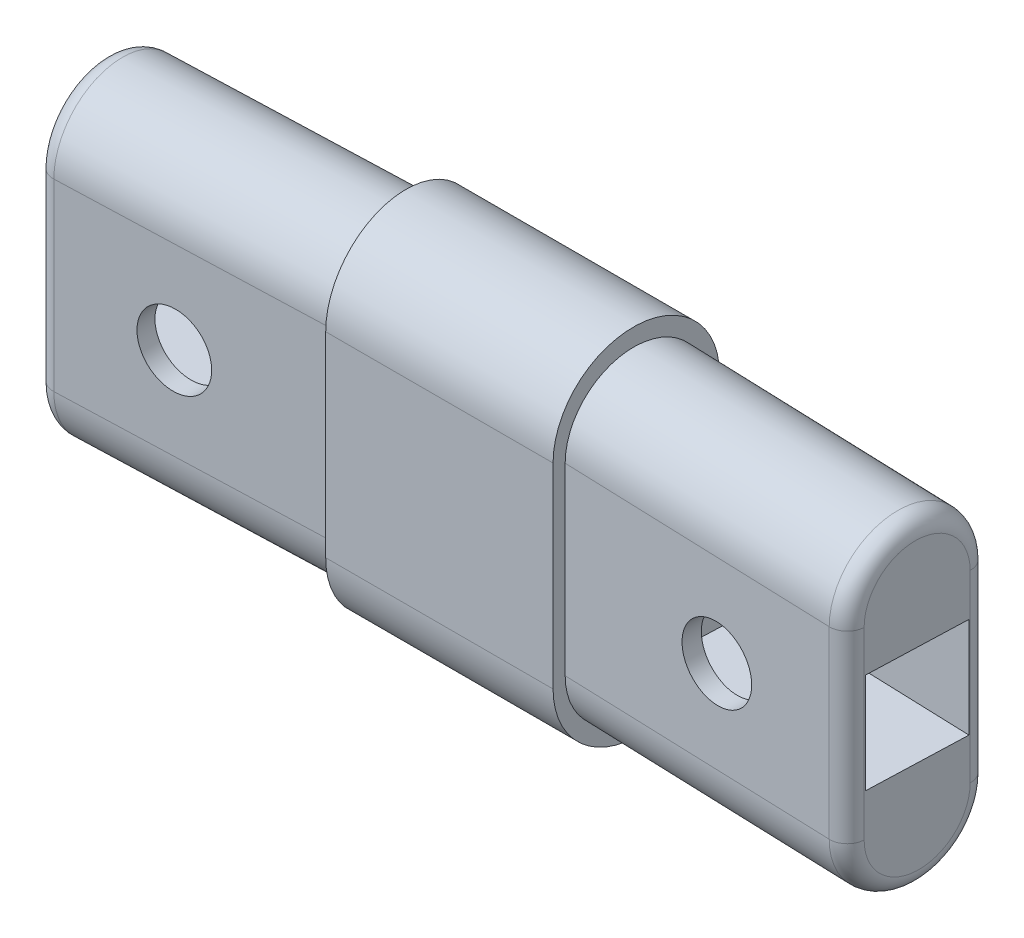
ISO-10303-21;
HEADER;
FILE_DESCRIPTION(('STEP AP214'),'2;1');
FILE_NAME('part.step','',(''),(''),'','','');
FILE_SCHEMA(('AUTOMOTIVE_DESIGN { 1 0 10303 214 1 1 1 1 }'));
ENDSEC;
DATA;
#1=APPLICATION_CONTEXT('core data for automotive mechanical design processes');
#2=APPLICATION_PROTOCOL_DEFINITION('international standard','automotive_design',2000,#1);
#3=PRODUCT_CONTEXT('',#1,'mechanical');
#4=PRODUCT('Part','Part','',(#3));
#5=PRODUCT_RELATED_PRODUCT_CATEGORY('part','',(#4));
#6=PRODUCT_DEFINITION_FORMATION('','',#4);
#7=PRODUCT_DEFINITION_CONTEXT('part definition',#1,'design');
#8=PRODUCT_DEFINITION('design','',#6,#7);
#9=PRODUCT_DEFINITION_SHAPE('','',#8);
#10=(LENGTH_UNIT() NAMED_UNIT(*) SI_UNIT(.MILLI.,.METRE.));
#11=(NAMED_UNIT(*) PLANE_ANGLE_UNIT() SI_UNIT($,.RADIAN.));
#12=(NAMED_UNIT(*) SI_UNIT($,.STERADIAN.) SOLID_ANGLE_UNIT());
#13=UNCERTAINTY_MEASURE_WITH_UNIT(LENGTH_MEASURE(1.E-05),#10,'distance_accuracy_value','');
#14=(GEOMETRIC_REPRESENTATION_CONTEXT(3) GLOBAL_UNCERTAINTY_ASSIGNED_CONTEXT((#13)) GLOBAL_UNIT_ASSIGNED_CONTEXT((#10,
#11,#12)) REPRESENTATION_CONTEXT('',''));
#15=CARTESIAN_POINT('',(0.,0.,0.));
#16=DIRECTION('',(0.,0.,1.));
#17=DIRECTION('',(1.,0.,0.));
#18=AXIS2_PLACEMENT_3D('',#15,#16,#17);
#19=CARTESIAN_POINT('',(-34.9847706754774,-7.9,0.872487417562356));
#20=DIRECTION('',(-0.999390827019096,0.,0.0348994967024943));
#21=DIRECTION('',(-0.0348994967024943,0.,-0.999390827019096));
#22=AXIS2_PLACEMENT_3D('',#19,#20,#21);
#23=PLANE('',#22);
#24=CARTESIAN_POINT('',(-34.9847706754774,7.9,0.872487417562356));
#25=DIRECTION('',(-0.999390827019096,0.,0.0348994967024943));
#26=DIRECTION('',(0.0348994967024943,0.,0.999390827019096));
#27=AXIS2_PLACEMENT_3D('',#24,#25,#26);
#28=CIRCLE('',#27,4.4);
#29=CARTESIAN_POINT('',(-34.8312128899864,7.9,5.26980705644638));
#30=VERTEX_POINT('',#29);
#31=CARTESIAN_POINT('',(-35.1383284609684,7.9,-3.52483222132167));
#32=VERTEX_POINT('',#31);
#33=EDGE_CURVE('E384',#30,#32,#28,.T.);
#34=ORIENTED_EDGE('',*,*,#33,.T.);
#35=DIRECTION('',(0.,1.,0.));
#36=VECTOR('',#35,1.);
#37=CARTESIAN_POINT('',(-35.1383284609684,-7.9,-3.52483222132167));
#38=LINE('',#37,#36);
#39=CARTESIAN_POINT('',(-35.1383284609684,-7.9,-3.52483222132167));
#40=VERTEX_POINT('',#39);
#41=EDGE_CURVE('E386',#32,#40,#38,.F.);
#42=ORIENTED_EDGE('',*,*,#41,.T.);
#43=CARTESIAN_POINT('',(-34.9847706754774,-7.9,0.872487417562356));
#44=DIRECTION('',(-0.999390827019096,0.,0.0348994967024943));
#45=DIRECTION('',(0.0348994967024943,0.,0.999390827019096));
#46=AXIS2_PLACEMENT_3D('',#43,#44,#45);
#47=CIRCLE('',#46,4.4);
#48=CARTESIAN_POINT('',(-34.8312128899864,-7.9,5.26980705644638));
#49=VERTEX_POINT('',#48);
#50=EDGE_CURVE('E380',#40,#49,#47,.T.);
#51=ORIENTED_EDGE('',*,*,#50,.T.);
#52=DIRECTION('',(0.,-1.,0.));
#53=VECTOR('',#52,1.);
#54=CARTESIAN_POINT('',(-34.8312128899864,-7.9,5.26980705644638));
#55=LINE('',#54,#53);
#56=EDGE_CURVE('E382',#49,#30,#55,.F.);
#57=ORIENTED_EDGE('',*,*,#56,.T.);
#58=EDGE_LOOP('',(#34,#42,#51,#57));
#59=FACE_BOUND('',#58,.T.);
#60=DIRECTION('',(0.0348994967024943,0.,0.999390827019096));
#61=VECTOR('',#60,1.);
#62=CARTESIAN_POINT('',(-35.1348385112981,4.3,-3.42489313861976));
#63=LINE('',#62,#61);
#64=CARTESIAN_POINT('',(-35.1348385112981,4.3,-3.42489313861976));
#65=VERTEX_POINT('',#64);
#66=CARTESIAN_POINT('',(-34.8347028396567,4.3,5.16986797374447));
#67=VERTEX_POINT('',#66);
#68=EDGE_CURVE('E228',#65,#67,#63,.T.);
#69=ORIENTED_EDGE('',*,*,#68,.T.);
#70=DIRECTION('',(0.,-1.,0.));
#71=VECTOR('',#70,1.);
#72=CARTESIAN_POINT('',(-34.8347028396567,4.3,5.16986797374447));
#73=LINE('',#72,#71);
#74=CARTESIAN_POINT('',(-34.8347028396567,-4.3,5.16986797374447));
#75=VERTEX_POINT('',#74);
#76=EDGE_CURVE('E51',#67,#75,#73,.T.);
#77=ORIENTED_EDGE('',*,*,#76,.T.);
#78=DIRECTION('',(-0.0348994967024943,0.,-0.999390827019096));
#79=VECTOR('',#78,1.);
#80=CARTESIAN_POINT('',(-35.1348385112981,-4.3,-3.42489313861976));
#81=LINE('',#80,#79);
#82=CARTESIAN_POINT('',(-35.1348385112981,-4.3,-3.42489313861976));
#83=VERTEX_POINT('',#82);
#84=EDGE_CURVE('E216',#75,#83,#81,.T.);
#85=ORIENTED_EDGE('',*,*,#84,.T.);
#86=DIRECTION('',(0.,1.,0.));
#87=VECTOR('',#86,1.);
#88=CARTESIAN_POINT('',(-35.1348385112981,4.3,-3.42489313861976));
#89=LINE('',#88,#87);
#90=EDGE_CURVE('E219',#83,#65,#89,.T.);
#91=ORIENTED_EDGE('',*,*,#90,.T.);
#92=EDGE_LOOP('',(#69,#77,#85,#91));
#93=FACE_BOUND('',#92,.T.);
#94=ADVANCED_FACE('F34',(#59,#93),#23,.T.);
#95=CARTESIAN_POINT('',(10.3492076949174,-15.3,-10.));
#96=DIRECTION('',(-0.999390827019096,0.,-0.0348994967024942));
#97=DIRECTION('',(-0.0348994967024942,0.,0.999390827019096));
#98=AXIS2_PLACEMENT_3D('',#95,#96,#97);
#99=PLANE('',#98);
#100=CARTESIAN_POINT('',(10.,8.4,0.));
#101=DIRECTION('',(-0.999390827019096,0.,-0.0348994967024942));
#102=DIRECTION('',(0.0348994967024942,0.,-0.999390827019096));
#103=AXIS2_PLACEMENT_3D('',#100,#101,#102);
#104=ELLIPSE('',#103,6.90420585566187,6.90000000000001);
#105=CARTESIAN_POINT('',(9.75904669050698,8.4,6.90000000000001));
#106=VERTEX_POINT('',#105);
#107=CARTESIAN_POINT('',(10.240953309493,8.4,-6.9));
#108=VERTEX_POINT('',#107);
#109=EDGE_CURVE('E318',#106,#108,#104,.T.);
#110=ORIENTED_EDGE('',*,*,#109,.F.);
#111=DIRECTION('',(0.,1.,0.));
#112=VECTOR('',#111,1.);
#113=CARTESIAN_POINT('',(9.75904669050698,8.4,6.90000000000001));
#114=LINE('',#113,#112);
#115=CARTESIAN_POINT('',(9.75904669050698,-8.4,6.90000000000001));
#116=VERTEX_POINT('',#115);
#117=EDGE_CURVE('E345',#116,#106,#114,.T.);
#118=ORIENTED_EDGE('',*,*,#117,.F.);
#119=CARTESIAN_POINT('',(10.,-8.4,0.));
#120=DIRECTION('',(-0.999390827019096,0.,-0.0348994967024942));
#121=DIRECTION('',(0.0348994967024942,0.,-0.999390827019096));
#122=AXIS2_PLACEMENT_3D('',#119,#120,#121);
#123=ELLIPSE('',#122,6.90420585566187,6.90000000000001);
#124=CARTESIAN_POINT('',(10.240953309493,-8.4,-6.90000000000001));
#125=VERTEX_POINT('',#124);
#126=EDGE_CURVE('E319',#125,#116,#123,.T.);
#127=ORIENTED_EDGE('',*,*,#126,.F.);
#128=DIRECTION('',(0.,-1.,0.));
#129=VECTOR('',#128,1.);
#130=CARTESIAN_POINT('',(10.240953309493,8.4,-6.9));
#131=LINE('',#130,#129);
#132=EDGE_CURVE('E321',#108,#125,#131,.T.);
#133=ORIENTED_EDGE('',*,*,#132,.F.);
#134=EDGE_LOOP('',(#110,#118,#127,#133));
#135=FACE_BOUND('',#134,.T.);
#136=CARTESIAN_POINT('',(10.,-7.9,0.));
#137=DIRECTION('',(0.999390827019096,0.,0.0348994967024943));
#138=DIRECTION('',(0.0348994967024943,0.,-0.999390827019096));
#139=AXIS2_PLACEMENT_3D('',#136,#137,#138);
#140=CIRCLE('',#139,5.9);
#141=CARTESIAN_POINT('',(9.79409296945528,-7.9,5.89640587941267));
#142=VERTEX_POINT('',#141);
#143=CARTESIAN_POINT('',(10.2059070305447,-7.9,-5.89640587941267));
#144=VERTEX_POINT('',#143);
#145=EDGE_CURVE('E297',#142,#144,#140,.T.);
#146=ORIENTED_EDGE('',*,*,#145,.F.);
#147=DIRECTION('',(0.,-1.,0.));
#148=VECTOR('',#147,1.);
#149=CARTESIAN_POINT('',(9.79409296945528,-7.9,5.89640587941267));
#150=LINE('',#149,#148);
#151=CARTESIAN_POINT('',(9.79409296945528,7.9,5.89640587941267));
#152=VERTEX_POINT('',#151);
#153=EDGE_CURVE('E307',#152,#142,#150,.T.);
#154=ORIENTED_EDGE('',*,*,#153,.F.);
#155=CARTESIAN_POINT('',(10.,7.9,0.));
#156=DIRECTION('',(0.999390827019096,0.,0.0348994967024943));
#157=DIRECTION('',(0.0348994967024943,0.,-0.999390827019096));
#158=AXIS2_PLACEMENT_3D('',#155,#156,#157);
#159=CIRCLE('',#158,5.9);
#160=CARTESIAN_POINT('',(10.2059070305447,7.9,-5.89640587941267));
#161=VERTEX_POINT('',#160);
#162=EDGE_CURVE('E304',#161,#152,#159,.T.);
#163=ORIENTED_EDGE('',*,*,#162,.F.);
#164=DIRECTION('',(0.,1.,0.));
#165=VECTOR('',#164,1.);
#166=CARTESIAN_POINT('',(10.2059070305447,-7.9,-5.89640587941267));
#167=LINE('',#166,#165);
#168=EDGE_CURVE('E300',#144,#161,#167,.T.);
#169=ORIENTED_EDGE('',*,*,#168,.F.);
#170=EDGE_LOOP('',(#146,#154,#163,#169));
#171=FACE_BOUND('',#170,.T.);
#172=ADVANCED_FACE('F445',(#135,#171),#99,.F.);
#173=CARTESIAN_POINT('',(-12.,8.4,0.));
#174=DIRECTION('',(1.,0.,0.));
#175=DIRECTION('',(0.,0.,-1.));
#176=AXIS2_PLACEMENT_3D('',#173,#174,#175);
#177=CYLINDRICAL_SURFACE('',#176,6.90000000000001);
#178=CARTESIAN_POINT('',(-10.,8.4,0.));
#179=DIRECTION('',(0.999390827019096,0.,-0.0348994967024942));
#180=DIRECTION('',(0.0348994967024942,0.,0.999390827019096));
#181=AXIS2_PLACEMENT_3D('',#178,#179,#180);
#182=ELLIPSE('',#181,6.90420585566187,6.90000000000001);
#183=CARTESIAN_POINT('',(-10.240953309493,8.4,-6.9));
#184=VERTEX_POINT('',#183);
#185=CARTESIAN_POINT('',(-9.75904669050698,8.4,6.90000000000001));
#186=VERTEX_POINT('',#185);
#187=EDGE_CURVE('E331',#184,#186,#182,.T.);
#188=ORIENTED_EDGE('',*,*,#187,.T.);
#189=DIRECTION('',(1.,0.,0.));
#190=VECTOR('',#189,1.);
#191=CARTESIAN_POINT('',(-12.,8.4,6.90000000000001));
#192=LINE('',#191,#190);
#193=EDGE_CURVE('E333',#186,#106,#192,.T.);
#194=ORIENTED_EDGE('',*,*,#193,.T.);
#195=ORIENTED_EDGE('',*,*,#109,.T.);
#196=DIRECTION('',(1.,0.,0.));
#197=VECTOR('',#196,1.);
#198=CARTESIAN_POINT('',(-12.,8.4,-6.9));
#199=LINE('',#198,#197);
#200=EDGE_CURVE('E342',#184,#108,#199,.T.);
#201=ORIENTED_EDGE('',*,*,#200,.F.);
#202=EDGE_LOOP('',(#188,#194,#195,#201));
#203=FACE_BOUND('',#202,.T.);
#204=ADVANCED_FACE('F450',(#203),#177,.T.);
#205=CARTESIAN_POINT('',(-12.,8.4,-6.9));
#206=DIRECTION('',(0.,0.,1.));
#207=DIRECTION('',(1.,0.,0.));
#208=AXIS2_PLACEMENT_3D('',#205,#206,#207);
#209=PLANE('',#208);
#210=DIRECTION('',(1.,0.,0.));
#211=VECTOR('',#210,1.);
#212=CARTESIAN_POINT('',(-12.,-8.4,-6.90000000000001));
#213=LINE('',#212,#211);
#214=CARTESIAN_POINT('',(-10.240953309493,-8.4,-6.90000000000001));
#215=VERTEX_POINT('',#214);
#216=EDGE_CURVE('E339',#215,#125,#213,.T.);
#217=ORIENTED_EDGE('',*,*,#216,.F.);
#218=DIRECTION('',(0.,1.,0.));
#219=VECTOR('',#218,1.);
#220=CARTESIAN_POINT('',(-10.240953309493,8.4,-6.9));
#221=LINE('',#220,#219);
#222=EDGE_CURVE('E328',#215,#184,#221,.T.);
#223=ORIENTED_EDGE('',*,*,#222,.T.);
#224=ORIENTED_EDGE('',*,*,#200,.T.);
#225=ORIENTED_EDGE('',*,*,#132,.T.);
#226=EDGE_LOOP('',(#217,#223,#224,#225));
#227=FACE_BOUND('',#226,.T.);
#228=ADVANCED_FACE('F490',(#227),#209,.F.);
#229=CARTESIAN_POINT('',(-12.,-8.4,0.));
#230=DIRECTION('',(1.,0.,0.));
#231=DIRECTION('',(0.,0.,-1.));
#232=AXIS2_PLACEMENT_3D('',#229,#230,#231);
#233=CYLINDRICAL_SURFACE('',#232,6.90000000000001);
#234=CARTESIAN_POINT('',(-10.,-8.4,0.));
#235=DIRECTION('',(0.999390827019096,0.,-0.0348994967024942));
#236=DIRECTION('',(0.0348994967024942,0.,0.999390827019096));
#237=AXIS2_PLACEMENT_3D('',#234,#235,#236);
#238=ELLIPSE('',#237,6.90420585566187,6.90000000000001);
#239=CARTESIAN_POINT('',(-9.75904669050698,-8.4,6.90000000000001));
#240=VERTEX_POINT('',#239);
#241=EDGE_CURVE('E326',#240,#215,#238,.T.);
#242=ORIENTED_EDGE('',*,*,#241,.T.);
#243=ORIENTED_EDGE('',*,*,#216,.T.);
#244=ORIENTED_EDGE('',*,*,#126,.T.);
#245=DIRECTION('',(1.,0.,0.));
#246=VECTOR('',#245,1.);
#247=CARTESIAN_POINT('',(-12.,-8.4,6.90000000000001));
#248=LINE('',#247,#246);
#249=EDGE_CURVE('E336',#240,#116,#248,.T.);
#250=ORIENTED_EDGE('',*,*,#249,.F.);
#251=EDGE_LOOP('',(#242,#243,#244,#250));
#252=FACE_BOUND('',#251,.T.);
#253=ADVANCED_FACE('F494',(#252),#233,.T.);
#254=CARTESIAN_POINT('',(-12.,8.4,6.90000000000001));
#255=DIRECTION('',(0.,0.,-1.));
#256=DIRECTION('',(-1.,0.,0.));
#257=AXIS2_PLACEMENT_3D('',#254,#255,#256);
#258=PLANE('',#257);
#259=ORIENTED_EDGE('',*,*,#193,.F.);
#260=DIRECTION('',(0.,-1.,0.));
#261=VECTOR('',#260,1.);
#262=CARTESIAN_POINT('',(-9.75904669050698,8.4,6.90000000000001));
#263=LINE('',#262,#261);
#264=EDGE_CURVE('E348',#186,#240,#263,.T.);
#265=ORIENTED_EDGE('',*,*,#264,.T.);
#266=ORIENTED_EDGE('',*,*,#249,.T.);
#267=ORIENTED_EDGE('',*,*,#117,.T.);
#268=EDGE_LOOP('',(#259,#265,#266,#267));
#269=FACE_BOUND('',#268,.T.);
#270=ADVANCED_FACE('F498',(#269),#258,.F.);
#271=CARTESIAN_POINT('',(-10.3492076949174,-15.3,-10.));
#272=DIRECTION('',(0.999390827019096,0.,-0.0348994967024942));
#273=DIRECTION('',(-0.0348994967024942,0.,-0.999390827019096));
#274=AXIS2_PLACEMENT_3D('',#271,#272,#273);
#275=PLANE('',#274);
#276=DIRECTION('',(0.,-1.,0.));
#277=VECTOR('',#276,1.);
#278=CARTESIAN_POINT('',(-9.79409296945528,-7.9,5.89640587941267));
#279=LINE('',#278,#277);
#280=CARTESIAN_POINT('',(-9.79409296945528,7.9,5.89640587941267));
#281=VERTEX_POINT('',#280);
#282=CARTESIAN_POINT('',(-9.79409296945528,-7.9,5.89640587941267));
#283=VERTEX_POINT('',#282);
#284=EDGE_CURVE('E241',#281,#283,#279,.T.);
#285=ORIENTED_EDGE('',*,*,#284,.T.);
#286=CARTESIAN_POINT('',(-10.,-7.9,0.));
#287=DIRECTION('',(0.999390827019096,0.,-0.0348994967024943));
#288=DIRECTION('',(-0.0348994967024943,0.,-0.999390827019096));
#289=AXIS2_PLACEMENT_3D('',#286,#287,#288);
#290=CIRCLE('',#289,5.9);
#291=CARTESIAN_POINT('',(-10.2059070305447,-7.9,-5.89640587941267));
#292=VERTEX_POINT('',#291);
#293=EDGE_CURVE('E238',#283,#292,#290,.T.);
#294=ORIENTED_EDGE('',*,*,#293,.T.);
#295=DIRECTION('',(0.,1.,0.));
#296=VECTOR('',#295,1.);
#297=CARTESIAN_POINT('',(-10.2059070305447,-7.9,-5.89640587941267));
#298=LINE('',#297,#296);
#299=CARTESIAN_POINT('',(-10.2059070305447,7.9,-5.89640587941267));
#300=VERTEX_POINT('',#299);
#301=EDGE_CURVE('E247',#292,#300,#298,.T.);
#302=ORIENTED_EDGE('',*,*,#301,.T.);
#303=CARTESIAN_POINT('',(-10.,7.9,0.));
#304=DIRECTION('',(0.999390827019096,0.,-0.0348994967024943));
#305=DIRECTION('',(-0.0348994967024943,0.,-0.999390827019096));
#306=AXIS2_PLACEMENT_3D('',#303,#304,#305);
#307=CIRCLE('',#306,5.9);
#308=EDGE_CURVE('E244',#300,#281,#307,.T.);
#309=ORIENTED_EDGE('',*,*,#308,.T.);
#310=EDGE_LOOP('',(#285,#294,#302,#309));
#311=FACE_BOUND('',#310,.T.);
#312=ORIENTED_EDGE('',*,*,#187,.F.);
#313=ORIENTED_EDGE('',*,*,#222,.F.);
#314=ORIENTED_EDGE('',*,*,#241,.F.);
#315=ORIENTED_EDGE('',*,*,#264,.F.);
#316=EDGE_LOOP('',(#312,#313,#314,#315));
#317=FACE_BOUND('',#316,.T.);
#318=ADVANCED_FACE('F427',(#311,#317),#275,.F.);
#319=CARTESIAN_POINT('',(34.9847706754774,-7.9,0.872487417562356));
#320=DIRECTION('',(-0.999390827019096,0.,-0.0348994967024943));
#321=DIRECTION('',(-0.0348994967024943,0.,0.999390827019096));
#322=AXIS2_PLACEMENT_3D('',#319,#320,#321);
#323=CYLINDRICAL_SURFACE('',#322,5.9);
#324=DIRECTION('',(-0.999390827019096,0.,-0.0348994967024943));
#325=VECTOR('',#324,1.);
#326=CARTESIAN_POINT('',(35.1906777060221,-7.9,-5.02391846185031));
#327=LINE('',#326,#325);
#328=CARTESIAN_POINT('',(33.6915914654935,-7.9,-5.07626770690405));
#329=VERTEX_POINT('',#328);
#330=EDGE_CURVE('E316',#329,#144,#327,.T.);
#331=ORIENTED_EDGE('',*,*,#330,.F.);
#332=CARTESIAN_POINT('',(33.4856844349488,-7.9,0.820138172508615));
#333=DIRECTION('',(0.999390827019096,0.,0.0348994967024943));
#334=DIRECTION('',(0.0348994967024943,0.,-0.999390827019096));
#335=AXIS2_PLACEMENT_3D('',#332,#333,#334);
#336=CIRCLE('',#335,5.9);
#337=CARTESIAN_POINT('',(33.279777404404,-7.9,6.71654405192128));
#338=VERTEX_POINT('',#337);
#339=EDGE_CURVE('E367',#329,#338,#336,.F.);
#340=ORIENTED_EDGE('',*,*,#339,.T.);
#341=DIRECTION('',(-0.999390827019096,0.,-0.0348994967024943));
#342=VECTOR('',#341,1.);
#343=CARTESIAN_POINT('',(34.7788636449327,-7.9,6.76889329697502));
#344=LINE('',#343,#342);
#345=EDGE_CURVE('E310',#338,#142,#344,.T.);
#346=ORIENTED_EDGE('',*,*,#345,.T.);
#347=ORIENTED_EDGE('',*,*,#145,.T.);
#348=EDGE_LOOP('',(#331,#340,#346,#347));
#349=FACE_BOUND('',#348,.T.);
#350=ADVANCED_FACE('F505',(#349),#323,.T.);
#351=CARTESIAN_POINT('',(35.1906777060221,-7.9,-5.02391846185031));
#352=DIRECTION('',(-0.0348994967024943,0.,0.999390827019096));
#353=DIRECTION('',(0.999390827019096,0.,0.0348994967024943));
#354=AXIS2_PLACEMENT_3D('',#351,#352,#353);
#355=PLANE('',#354);
#356=DIRECTION('',(-0.999390827019096,0.,-0.0348994967024943));
#357=VECTOR('',#356,1.);
#358=CARTESIAN_POINT('',(35.1906777060221,7.9,-5.02391846185031));
#359=LINE('',#358,#357);
#360=CARTESIAN_POINT('',(33.6915914654935,7.9,-5.07626770690405));
#361=VERTEX_POINT('',#360);
#362=EDGE_CURVE('E314',#361,#161,#359,.T.);
#363=ORIENTED_EDGE('',*,*,#362,.F.);
#364=DIRECTION('',(0.,1.,0.));
#365=VECTOR('',#364,1.);
#366=CARTESIAN_POINT('',(33.6915914654935,-7.9,-5.07626770690405));
#367=LINE('',#366,#365);
#368=EDGE_CURVE('E365',#361,#329,#367,.F.);
#369=ORIENTED_EDGE('',*,*,#368,.T.);
#370=ORIENTED_EDGE('',*,*,#330,.T.);
#371=ORIENTED_EDGE('',*,*,#168,.T.);
#372=EDGE_LOOP('',(#363,#369,#370,#371));
#373=FACE_BOUND('',#372,.T.);
#374=ADVANCED_FACE('F508',(#373),#355,.F.);
#375=CARTESIAN_POINT('',(34.9847706754774,7.9,0.872487417562356));
#376=DIRECTION('',(-0.999390827019096,0.,-0.0348994967024943));
#377=DIRECTION('',(-0.0348994967024943,0.,0.999390827019096));
#378=AXIS2_PLACEMENT_3D('',#375,#376,#377);
#379=CYLINDRICAL_SURFACE('',#378,5.9);
#380=DIRECTION('',(-0.999390827019096,0.,-0.0348994967024943));
#381=VECTOR('',#380,1.);
#382=CARTESIAN_POINT('',(34.7788636449327,7.9,6.76889329697502));
#383=LINE('',#382,#381);
#384=CARTESIAN_POINT('',(33.279777404404,7.9,6.71654405192128));
#385=VERTEX_POINT('',#384);
#386=EDGE_CURVE('E312',#385,#152,#383,.T.);
#387=ORIENTED_EDGE('',*,*,#386,.F.);
#388=CARTESIAN_POINT('',(33.4856844349488,7.9,0.820138172508615));
#389=DIRECTION('',(0.999390827019096,0.,0.0348994967024943));
#390=DIRECTION('',(0.0348994967024943,0.,-0.999390827019096));
#391=AXIS2_PLACEMENT_3D('',#388,#389,#390);
#392=CIRCLE('',#391,5.9);
#393=EDGE_CURVE('E363',#385,#361,#392,.F.);
#394=ORIENTED_EDGE('',*,*,#393,.T.);
#395=ORIENTED_EDGE('',*,*,#362,.T.);
#396=ORIENTED_EDGE('',*,*,#162,.T.);
#397=EDGE_LOOP('',(#387,#394,#395,#396));
#398=FACE_BOUND('',#397,.T.);
#399=ADVANCED_FACE('F512',(#398),#379,.T.);
#400=CARTESIAN_POINT('',(34.7788636449327,-7.9,6.76889329697502));
#401=DIRECTION('',(0.0348994967024943,0.,-0.999390827019096));
#402=DIRECTION('',(-0.999390827019096,0.,-0.0348994967024943));
#403=AXIS2_PLACEMENT_3D('',#400,#401,#402);
#404=PLANE('',#403);
#405=CARTESIAN_POINT('',(23.2858691342131,0.,6.36754908489634));
#406=DIRECTION('',(-0.0348994967024943,0.,0.999390827019096));
#407=DIRECTION('',(0.999390827019096,0.,0.0348994967024943));
#408=AXIS2_PLACEMENT_3D('',#405,#406,#407);
#409=CIRCLE('',#408,3.1);
#410=CARTESIAN_POINT('',(26.3839806979723,0.,6.47573752467407));
#411=VERTEX_POINT('',#410);
#412=EDGE_CURVE('E258',#411,#411,#409,.T.);
#413=ORIENTED_EDGE('',*,*,#412,.F.);
#414=EDGE_LOOP('',(#413));
#415=FACE_BOUND('',#414,.T.);
#416=ORIENTED_EDGE('',*,*,#345,.F.);
#417=DIRECTION('',(0.,-1.,0.));
#418=VECTOR('',#417,1.);
#419=CARTESIAN_POINT('',(33.279777404404,7.9,6.71654405192128));
#420=LINE('',#419,#418);
#421=EDGE_CURVE('E360',#338,#385,#420,.F.);
#422=ORIENTED_EDGE('',*,*,#421,.T.);
#423=ORIENTED_EDGE('',*,*,#386,.T.);
#424=ORIENTED_EDGE('',*,*,#153,.T.);
#425=EDGE_LOOP('',(#416,#422,#423,#424));
#426=FACE_BOUND('',#425,.T.);
#427=ADVANCED_FACE('F516',(#415,#426),#404,.F.);
#428=CARTESIAN_POINT('',(34.9847706754774,-7.9,0.872487417562356));
#429=DIRECTION('',(0.999390827019096,0.,0.0348994967024943));
#430=DIRECTION('',(0.0348994967024943,0.,-0.999390827019096));
#431=AXIS2_PLACEMENT_3D('',#428,#429,#430);
#432=PLANE('',#431);
#433=DIRECTION('',(0.,-1.,0.));
#434=VECTOR('',#433,1.);
#435=CARTESIAN_POINT('',(34.8347028396567,4.3,5.16986797374447));
#436=LINE('',#435,#434);
#437=CARTESIAN_POINT('',(34.8347028396567,4.3,5.16986797374447));
#438=VERTEX_POINT('',#437);
#439=CARTESIAN_POINT('',(34.8347028396567,-4.3,5.16986797374447));
#440=VERTEX_POINT('',#439);
#441=EDGE_CURVE('E264',#438,#440,#436,.T.);
#442=ORIENTED_EDGE('',*,*,#441,.F.);
#443=DIRECTION('',(-0.0348994967024943,0.,0.999390827019096));
#444=VECTOR('',#443,1.);
#445=CARTESIAN_POINT('',(35.1348385112981,4.3,-3.42489313861976));
#446=LINE('',#445,#444);
#447=CARTESIAN_POINT('',(35.1348385112981,4.3,-3.42489313861976));
#448=VERTEX_POINT('',#447);
#449=EDGE_CURVE('E269',#448,#438,#446,.T.);
#450=ORIENTED_EDGE('',*,*,#449,.F.);
#451=DIRECTION('',(0.,1.,0.));
#452=VECTOR('',#451,1.);
#453=CARTESIAN_POINT('',(35.1348385112981,4.3,-3.42489313861976));
#454=LINE('',#453,#452);
#455=CARTESIAN_POINT('',(35.1348385112981,-4.3,-3.42489313861976));
#456=VERTEX_POINT('',#455);
#457=EDGE_CURVE('E283',#456,#448,#454,.T.);
#458=ORIENTED_EDGE('',*,*,#457,.F.);
#459=DIRECTION('',(0.0348994967024943,0.,-0.999390827019096));
#460=VECTOR('',#459,1.);
#461=CARTESIAN_POINT('',(35.1348385112981,-4.3,-3.42489313861976));
#462=LINE('',#461,#460);
#463=EDGE_CURVE('E280',#440,#456,#462,.T.);
#464=ORIENTED_EDGE('',*,*,#463,.F.);
#465=EDGE_LOOP('',(#442,#450,#458,#464));
#466=FACE_BOUND('',#465,.T.);
#467=CARTESIAN_POINT('',(34.9847706754774,7.9,0.872487417562356));
#468=DIRECTION('',(0.999390827019096,0.,0.0348994967024943));
#469=DIRECTION('',(0.0348994967024943,0.,-0.999390827019096));
#470=AXIS2_PLACEMENT_3D('',#467,#468,#469);
#471=CIRCLE('',#470,4.4);
#472=CARTESIAN_POINT('',(35.1383284609684,7.9,-3.52483222132167));
#473=VERTEX_POINT('',#472);
#474=CARTESIAN_POINT('',(34.8312128899864,7.9,5.26980705644638));
#475=VERTEX_POINT('',#474);
#476=EDGE_CURVE('E355',#473,#475,#471,.T.);
#477=ORIENTED_EDGE('',*,*,#476,.T.);
#478=DIRECTION('',(0.,-1.,0.));
#479=VECTOR('',#478,1.);
#480=CARTESIAN_POINT('',(34.8312128899864,-7.9,5.26980705644638));
#481=LINE('',#480,#479);
#482=CARTESIAN_POINT('',(34.8312128899864,-7.9,5.26980705644638));
#483=VERTEX_POINT('',#482);
#484=EDGE_CURVE('E357',#475,#483,#481,.T.);
#485=ORIENTED_EDGE('',*,*,#484,.T.);
#486=CARTESIAN_POINT('',(34.9847706754774,-7.9,0.872487417562356));
#487=DIRECTION('',(0.999390827019096,0.,0.0348994967024943));
#488=DIRECTION('',(0.0348994967024943,0.,-0.999390827019096));
#489=AXIS2_PLACEMENT_3D('',#486,#487,#488);
#490=CIRCLE('',#489,4.4);
#491=CARTESIAN_POINT('',(35.1383284609684,-7.9,-3.52483222132167));
#492=VERTEX_POINT('',#491);
#493=EDGE_CURVE('E351',#483,#492,#490,.T.);
#494=ORIENTED_EDGE('',*,*,#493,.T.);
#495=DIRECTION('',(0.,1.,0.));
#496=VECTOR('',#495,1.);
#497=CARTESIAN_POINT('',(35.1383284609684,7.9,-3.52483222132167));
#498=LINE('',#497,#496);
#499=EDGE_CURVE('E353',#492,#473,#498,.T.);
#500=ORIENTED_EDGE('',*,*,#499,.T.);
#501=EDGE_LOOP('',(#477,#485,#494,#500));
#502=FACE_BOUND('',#501,.T.);
#503=ADVANCED_FACE('F474',(#466,#502),#432,.T.);
#504=CARTESIAN_POINT('',(33.6392422204397,-7.9,-3.57718146637541));
#505=DIRECTION('',(0.,-1.,0.));
#506=DIRECTION('',(0.,0.,-1.));
#507=AXIS2_PLACEMENT_3D('',#504,#505,#506);
#508=CYLINDRICAL_SURFACE('',#507,1.5);
#509=CARTESIAN_POINT('',(33.6392422204397,-7.9,-3.57718146637541));
#510=DIRECTION('',(0.,-1.,0.));
#511=DIRECTION('',(0.,0.,-1.));
#512=AXIS2_PLACEMENT_3D('',#509,#510,#511);
#513=CIRCLE('',#512,1.5);
#514=EDGE_CURVE('E373',#329,#492,#513,.T.);
#515=ORIENTED_EDGE('',*,*,#514,.F.);
#516=ORIENTED_EDGE('',*,*,#368,.F.);
#517=CARTESIAN_POINT('',(33.6392422204397,7.9,-3.57718146637541));
#518=DIRECTION('',(0.,1.,0.));
#519=DIRECTION('',(0.,0.,1.));
#520=AXIS2_PLACEMENT_3D('',#517,#518,#519);
#521=CIRCLE('',#520,1.5);
#522=EDGE_CURVE('E301',#473,#361,#521,.T.);
#523=ORIENTED_EDGE('',*,*,#522,.F.);
#524=ORIENTED_EDGE('',*,*,#499,.F.);
#525=EDGE_LOOP('',(#515,#516,#523,#524));
#526=FACE_BOUND('',#525,.T.);
#527=ADVANCED_FACE('F470',(#526),#508,.T.);
#528=CARTESIAN_POINT('',(33.4856844349488,7.9,0.820138172508615));
#529=DIRECTION('',(0.999390827019096,0.,0.0348994967024943));
#530=DIRECTION('',(0.0348994967024943,0.,-0.999390827019096));
#531=AXIS2_PLACEMENT_3D('',#528,#529,#530);
#532=TOROIDAL_SURFACE('',#531,4.4,1.5);
#533=ORIENTED_EDGE('',*,*,#522,.T.);
#534=ORIENTED_EDGE('',*,*,#393,.F.);
#535=CARTESIAN_POINT('',(33.3321266494578,7.9,5.21745781139264));
#536=DIRECTION('',(0.,-1.,0.));
#537=DIRECTION('',(0.,0.,-1.));
#538=AXIS2_PLACEMENT_3D('',#535,#536,#537);
#539=CIRCLE('',#538,1.5);
#540=EDGE_CURVE('E371',#475,#385,#539,.T.);
#541=ORIENTED_EDGE('',*,*,#540,.F.);
#542=ORIENTED_EDGE('',*,*,#476,.F.);
#543=EDGE_LOOP('',(#533,#534,#541,#542));
#544=FACE_BOUND('',#543,.T.);
#545=ADVANCED_FACE('F473',(#544),#532,.T.);
#546=CARTESIAN_POINT('',(33.4856844349488,-7.9,0.820138172508615));
#547=DIRECTION('',(0.999390827019096,0.,0.0348994967024943));
#548=DIRECTION('',(0.0348994967024943,0.,-0.999390827019096));
#549=AXIS2_PLACEMENT_3D('',#546,#547,#548);
#550=TOROIDAL_SURFACE('',#549,4.4,1.5);
#551=ORIENTED_EDGE('',*,*,#514,.T.);
#552=ORIENTED_EDGE('',*,*,#493,.F.);
#553=CARTESIAN_POINT('',(33.3321266494578,-7.9,5.21745781139264));
#554=DIRECTION('',(0.,1.,0.));
#555=DIRECTION('',(0.,0.,1.));
#556=AXIS2_PLACEMENT_3D('',#553,#554,#555);
#557=CIRCLE('',#556,1.5);
#558=EDGE_CURVE('E290',#338,#483,#557,.T.);
#559=ORIENTED_EDGE('',*,*,#558,.F.);
#560=ORIENTED_EDGE('',*,*,#339,.F.);
#561=EDGE_LOOP('',(#551,#552,#559,#560));
#562=FACE_BOUND('',#561,.T.);
#563=ADVANCED_FACE('F478',(#562),#550,.T.);
#564=CARTESIAN_POINT('',(33.3321266494578,-7.9,5.21745781139264));
#565=DIRECTION('',(0.,1.,0.));
#566=DIRECTION('',(0.,0.,1.));
#567=AXIS2_PLACEMENT_3D('',#564,#565,#566);
#568=CYLINDRICAL_SURFACE('',#567,1.5);
#569=ORIENTED_EDGE('',*,*,#540,.T.);
#570=ORIENTED_EDGE('',*,*,#421,.F.);
#571=ORIENTED_EDGE('',*,*,#558,.T.);
#572=ORIENTED_EDGE('',*,*,#484,.F.);
#573=EDGE_LOOP('',(#569,#570,#571,#572));
#574=FACE_BOUND('',#573,.T.);
#575=ADVANCED_FACE('F482',(#574),#568,.T.);
#576=CARTESIAN_POINT('',(16.2460334571015,4.3,4.52073733507808));
#577=DIRECTION('',(-0.0348994967024943,0.,0.999390827019096));
#578=DIRECTION('',(0.999390827019096,0.,0.0348994967024943));
#579=AXIS2_PLACEMENT_3D('',#576,#577,#578);
#580=PLANE('',#579);
#581=CARTESIAN_POINT('',(23.341708328937,0.,4.76852376166578));
#582=DIRECTION('',(-0.0348994967024943,0.,0.999390827019096));
#583=DIRECTION('',(0.999390827019096,0.,0.0348994967024943));
#584=AXIS2_PLACEMENT_3D('',#581,#582,#583);
#585=CIRCLE('',#584,3.1);
#586=CARTESIAN_POINT('',(26.4398198926962,0.,4.87671220144351));
#587=VERTEX_POINT('',#586);
#588=EDGE_CURVE('E261',#587,#587,#585,.F.);
#589=ORIENTED_EDGE('',*,*,#588,.F.);
#590=EDGE_LOOP('',(#589));
#591=FACE_BOUND('',#590,.T.);
#592=ORIENTED_EDGE('',*,*,#441,.T.);
#593=DIRECTION('',(0.999390827019096,0.,0.0348994967024943));
#594=VECTOR('',#593,1.);
#595=CARTESIAN_POINT('',(16.2460334571015,-4.3,4.52073733507807));
#596=LINE('',#595,#594);
#597=CARTESIAN_POINT('',(16.2460334571015,-4.3,4.52073733507807));
#598=VERTEX_POINT('',#597);
#599=EDGE_CURVE('E278',#598,#440,#596,.T.);
#600=ORIENTED_EDGE('',*,*,#599,.F.);
#601=DIRECTION('',(0.,-1.,0.));
#602=VECTOR('',#601,1.);
#603=CARTESIAN_POINT('',(16.2460334571015,4.3,4.52073733507808));
#604=LINE('',#603,#602);
#605=CARTESIAN_POINT('',(16.2460334571015,4.3,4.52073733507808));
#606=VERTEX_POINT('',#605);
#607=EDGE_CURVE('E265',#606,#598,#604,.T.);
#608=ORIENTED_EDGE('',*,*,#607,.F.);
#609=DIRECTION('',(0.999390827019096,0.,0.0348994967024943));
#610=VECTOR('',#609,1.);
#611=CARTESIAN_POINT('',(16.2460334571015,4.3,4.52073733507808));
#612=LINE('',#611,#610);
#613=EDGE_CURVE('E288',#606,#438,#612,.T.);
#614=ORIENTED_EDGE('',*,*,#613,.T.);
#615=EDGE_LOOP('',(#592,#600,#608,#614));
#616=FACE_BOUND('',#615,.T.);
#617=ADVANCED_FACE('F486',(#591,#616),#580,.F.);
#618=CARTESIAN_POINT('',(16.5461691287429,4.3,-4.07402377728615));
#619=DIRECTION('',(0.,1.,0.));
#620=DIRECTION('',(0.,0.,1.));
#621=AXIS2_PLACEMENT_3D('',#618,#619,#620);
#622=PLANE('',#621);
#623=ORIENTED_EDGE('',*,*,#449,.T.);
#624=ORIENTED_EDGE('',*,*,#613,.F.);
#625=DIRECTION('',(-0.0348994967024943,0.,0.999390827019096));
#626=VECTOR('',#625,1.);
#627=CARTESIAN_POINT('',(16.5461691287429,4.3,-4.07402377728615));
#628=LINE('',#627,#626);
#629=CARTESIAN_POINT('',(16.5461691287429,4.3,-4.07402377728615));
#630=VERTEX_POINT('',#629);
#631=EDGE_CURVE('E275',#630,#606,#628,.T.);
#632=ORIENTED_EDGE('',*,*,#631,.F.);
#633=DIRECTION('',(0.999390827019096,0.,0.0348994967024943));
#634=VECTOR('',#633,1.);
#635=CARTESIAN_POINT('',(16.5461691287429,4.3,-4.07402377728615));
#636=LINE('',#635,#634);
#637=EDGE_CURVE('E291',#630,#448,#636,.T.);
#638=ORIENTED_EDGE('',*,*,#637,.T.);
#639=EDGE_LOOP('',(#623,#624,#632,#638));
#640=FACE_BOUND('',#639,.T.);
#641=ADVANCED_FACE('F526',(#640),#622,.F.);
#642=CARTESIAN_POINT('',(16.5461691287429,4.3,-4.07402377728615));
#643=DIRECTION('',(0.0348994967024943,0.,-0.999390827019096));
#644=DIRECTION('',(-0.999390827019096,0.,-0.0348994967024943));
#645=AXIS2_PLACEMENT_3D('',#642,#643,#644);
#646=PLANE('',#645);
#647=ORIENTED_EDGE('',*,*,#457,.T.);
#648=ORIENTED_EDGE('',*,*,#637,.F.);
#649=DIRECTION('',(0.,1.,0.));
#650=VECTOR('',#649,1.);
#651=CARTESIAN_POINT('',(16.5461691287429,4.3,-4.07402377728615));
#652=LINE('',#651,#650);
#653=CARTESIAN_POINT('',(16.5461691287429,-4.3,-4.07402377728615));
#654=VERTEX_POINT('',#653);
#655=EDGE_CURVE('E272',#654,#630,#652,.T.);
#656=ORIENTED_EDGE('',*,*,#655,.F.);
#657=DIRECTION('',(0.999390827019096,0.,0.0348994967024943));
#658=VECTOR('',#657,1.);
#659=CARTESIAN_POINT('',(16.5461691287429,-4.3,-4.07402377728615));
#660=LINE('',#659,#658);
#661=EDGE_CURVE('E293',#654,#456,#660,.T.);
#662=ORIENTED_EDGE('',*,*,#661,.T.);
#663=EDGE_LOOP('',(#647,#648,#656,#662));
#664=FACE_BOUND('',#663,.T.);
#665=ADVANCED_FACE('F532',(#664),#646,.F.);
#666=CARTESIAN_POINT('',(16.5461691287429,-4.3,-4.07402377728615));
#667=DIRECTION('',(0.,-1.,0.));
#668=DIRECTION('',(0.,0.,-1.));
#669=AXIS2_PLACEMENT_3D('',#666,#667,#668);
#670=PLANE('',#669);
#671=ORIENTED_EDGE('',*,*,#463,.T.);
#672=ORIENTED_EDGE('',*,*,#661,.F.);
#673=DIRECTION('',(0.0348994967024943,0.,-0.999390827019096));
#674=VECTOR('',#673,1.);
#675=CARTESIAN_POINT('',(16.5461691287429,-4.3,-4.07402377728615));
#676=LINE('',#675,#674);
#677=EDGE_CURVE('E268',#598,#654,#676,.T.);
#678=ORIENTED_EDGE('',*,*,#677,.F.);
#679=ORIENTED_EDGE('',*,*,#599,.T.);
#680=EDGE_LOOP('',(#671,#672,#678,#679));
#681=FACE_BOUND('',#680,.T.);
#682=ADVANCED_FACE('F528',(#681),#670,.F.);
#683=CARTESIAN_POINT('',(16.3839215442213,0.,0.572139147616524));
#684=DIRECTION('',(-0.999390827019096,0.,-0.0348994967024943));
#685=DIRECTION('',(-0.0348994967024943,0.,0.999390827019096));
#686=AXIS2_PLACEMENT_3D('',#683,#684,#685);
#687=PLANE('',#686);
#688=ORIENTED_EDGE('',*,*,#607,.T.);
#689=ORIENTED_EDGE('',*,*,#677,.T.);
#690=ORIENTED_EDGE('',*,*,#655,.T.);
#691=ORIENTED_EDGE('',*,*,#631,.T.);
#692=EDGE_LOOP('',(#688,#689,#690,#691));
#693=FACE_BOUND('',#692,.T.);
#694=ADVANCED_FACE('F531',(#693),#687,.F.);
#695=CARTESIAN_POINT('',(23.7630910606642,0.,-7.29829887312322));
#696=DIRECTION('',(-0.0348994967024943,0.,0.999390827019096));
#697=DIRECTION('',(0.999390827019096,0.,0.0348994967024943));
#698=AXIS2_PLACEMENT_3D('',#695,#696,#697);
#699=CYLINDRICAL_SURFACE('',#698,3.1);
#700=ORIENTED_EDGE('',*,*,#412,.T.);
#701=EDGE_LOOP('',(#700));
#702=FACE_BOUND('',#701,.T.);
#703=ORIENTED_EDGE('',*,*,#588,.T.);
#704=EDGE_LOOP('',(#703));
#705=FACE_BOUND('',#704,.T.);
#706=ADVANCED_FACE('F441',(#702,#705),#699,.F.);
#707=CARTESIAN_POINT('',(-34.9847706754774,-7.9,0.872487417562356));
#708=DIRECTION('',(0.999390827019096,0.,-0.0348994967024943));
#709=DIRECTION('',(-0.0348994967024943,0.,-0.999390827019096));
#710=AXIS2_PLACEMENT_3D('',#707,#708,#709);
#711=CYLINDRICAL_SURFACE('',#710,5.9);
#712=DIRECTION('',(0.999390827019096,0.,-0.0348994967024943));
#713=VECTOR('',#712,1.);
#714=CARTESIAN_POINT('',(-34.7788636449327,-7.9,6.76889329697502));
#715=LINE('',#714,#713);
#716=CARTESIAN_POINT('',(-33.279777404404,-7.9,6.71654405192128));
#717=VERTEX_POINT('',#716);
#718=EDGE_CURVE('E256',#717,#283,#715,.T.);
#719=ORIENTED_EDGE('',*,*,#718,.F.);
#720=CARTESIAN_POINT('',(-33.4856844349488,-7.9,0.820138172508615));
#721=DIRECTION('',(-0.999390827019096,0.,0.0348994967024943));
#722=DIRECTION('',(0.0348994967024943,0.,0.999390827019096));
#723=AXIS2_PLACEMENT_3D('',#720,#721,#722);
#724=CIRCLE('',#723,5.9);
#725=CARTESIAN_POINT('',(-33.6915914654935,-7.9,-5.07626770690405));
#726=VERTEX_POINT('',#725);
#727=EDGE_CURVE('E11',#717,#726,#724,.F.);
#728=ORIENTED_EDGE('',*,*,#727,.T.);
#729=DIRECTION('',(0.999390827019096,0.,-0.0348994967024943));
#730=VECTOR('',#729,1.);
#731=CARTESIAN_POINT('',(-35.1906777060221,-7.9,-5.02391846185031));
#732=LINE('',#731,#730);
#733=EDGE_CURVE('E250',#726,#292,#732,.T.);
#734=ORIENTED_EDGE('',*,*,#733,.T.);
#735=ORIENTED_EDGE('',*,*,#293,.F.);
#736=EDGE_LOOP('',(#719,#728,#734,#735));
#737=FACE_BOUND('',#736,.T.);
#738=ADVANCED_FACE('F431',(#737),#711,.T.);
#739=CARTESIAN_POINT('',(-34.7788636449327,-7.9,6.76889329697502));
#740=DIRECTION('',(0.0348994967024943,0.,0.999390827019096));
#741=DIRECTION('',(0.999390827019096,0.,-0.0348994967024943));
#742=AXIS2_PLACEMENT_3D('',#739,#740,#741);
#743=PLANE('',#742);
#744=CARTESIAN_POINT('',(-23.2858691342131,0.,6.36754908489634));
#745=DIRECTION('',(-0.0348994967024943,0.,-0.999390827019096));
#746=DIRECTION('',(-0.999390827019096,0.,0.0348994967024943));
#747=AXIS2_PLACEMENT_3D('',#744,#745,#746);
#748=CIRCLE('',#747,3.1);
#749=CARTESIAN_POINT('',(-26.3839806979723,0.,6.47573752467407));
#750=VERTEX_POINT('',#749);
#751=EDGE_CURVE('E688',#750,#750,#748,.T.);
#752=ORIENTED_EDGE('',*,*,#751,.T.);
#753=EDGE_LOOP('',(#752));
#754=FACE_BOUND('',#753,.T.);
#755=DIRECTION('',(0.999390827019096,0.,-0.0348994967024943));
#756=VECTOR('',#755,1.);
#757=CARTESIAN_POINT('',(-34.7788636449327,7.9,6.76889329697502));
#758=LINE('',#757,#756);
#759=CARTESIAN_POINT('',(-33.279777404404,7.9,6.71654405192128));
#760=VERTEX_POINT('',#759);
#761=EDGE_CURVE('E254',#760,#281,#758,.T.);
#762=ORIENTED_EDGE('',*,*,#761,.F.);
#763=DIRECTION('',(0.,-1.,0.));
#764=VECTOR('',#763,1.);
#765=CARTESIAN_POINT('',(-33.279777404404,-7.9,6.71654405192128));
#766=LINE('',#765,#764);
#767=EDGE_CURVE('E43',#760,#717,#766,.T.);
#768=ORIENTED_EDGE('',*,*,#767,.T.);
#769=ORIENTED_EDGE('',*,*,#718,.T.);
#770=ORIENTED_EDGE('',*,*,#284,.F.);
#771=EDGE_LOOP('',(#762,#768,#769,#770));
#772=FACE_BOUND('',#771,.T.);
#773=ADVANCED_FACE('F432',(#754,#772),#743,.T.);
#774=CARTESIAN_POINT('',(-34.9847706754774,7.9,0.872487417562356));
#775=DIRECTION('',(0.999390827019096,0.,-0.0348994967024943));
#776=DIRECTION('',(-0.0348994967024943,0.,-0.999390827019096));
#777=AXIS2_PLACEMENT_3D('',#774,#775,#776);
#778=CYLINDRICAL_SURFACE('',#777,5.9);
#779=DIRECTION('',(0.999390827019096,0.,-0.0348994967024943));
#780=VECTOR('',#779,1.);
#781=CARTESIAN_POINT('',(-35.1906777060221,7.9,-5.02391846185031));
#782=LINE('',#781,#780);
#783=CARTESIAN_POINT('',(-33.6915914654935,7.9,-5.07626770690405));
#784=VERTEX_POINT('',#783);
#785=EDGE_CURVE('E252',#784,#300,#782,.T.);
#786=ORIENTED_EDGE('',*,*,#785,.F.);
#787=CARTESIAN_POINT('',(-33.4856844349488,7.9,0.820138172508615));
#788=DIRECTION('',(-0.999390827019096,0.,0.0348994967024943));
#789=DIRECTION('',(0.0348994967024943,0.,0.999390827019096));
#790=AXIS2_PLACEMENT_3D('',#787,#788,#789);
#791=CIRCLE('',#790,5.9);
#792=EDGE_CURVE('E389',#784,#760,#791,.F.);
#793=ORIENTED_EDGE('',*,*,#792,.T.);
#794=ORIENTED_EDGE('',*,*,#761,.T.);
#795=ORIENTED_EDGE('',*,*,#308,.F.);
#796=EDGE_LOOP('',(#786,#793,#794,#795));
#797=FACE_BOUND('',#796,.T.);
#798=ADVANCED_FACE('F424',(#797),#778,.T.);
#799=CARTESIAN_POINT('',(-35.1906777060221,-7.9,-5.02391846185031));
#800=DIRECTION('',(-0.0348994967024943,0.,-0.999390827019096));
#801=DIRECTION('',(-0.999390827019096,0.,0.0348994967024943));
#802=AXIS2_PLACEMENT_3D('',#799,#800,#801);
#803=PLANE('',#802);
#804=ORIENTED_EDGE('',*,*,#733,.F.);
#805=DIRECTION('',(0.,1.,0.));
#806=VECTOR('',#805,1.);
#807=CARTESIAN_POINT('',(-33.6915914654935,-7.9,-5.07626770690405));
#808=LINE('',#807,#806);
#809=EDGE_CURVE('E369',#726,#784,#808,.T.);
#810=ORIENTED_EDGE('',*,*,#809,.T.);
#811=ORIENTED_EDGE('',*,*,#785,.T.);
#812=ORIENTED_EDGE('',*,*,#301,.F.);
#813=EDGE_LOOP('',(#804,#810,#811,#812));
#814=FACE_BOUND('',#813,.T.);
#815=ADVANCED_FACE('F421',(#814),#803,.T.);
#816=CARTESIAN_POINT('',(-33.3321266494578,-7.9,5.21745781139264));
#817=DIRECTION('',(0.,-1.,0.));
#818=DIRECTION('',(0.,0.,-1.));
#819=AXIS2_PLACEMENT_3D('',#816,#817,#818);
#820=CYLINDRICAL_SURFACE('',#819,1.5);
#821=CARTESIAN_POINT('',(-33.3321266494578,7.9,5.21745781139264));
#822=DIRECTION('',(0.,1.,0.));
#823=DIRECTION('',(0.,0.,1.));
#824=AXIS2_PLACEMENT_3D('',#821,#822,#823);
#825=CIRCLE('',#824,1.5);
#826=EDGE_CURVE('E394',#30,#760,#825,.T.);
#827=ORIENTED_EDGE('',*,*,#826,.F.);
#828=ORIENTED_EDGE('',*,*,#56,.F.);
#829=CARTESIAN_POINT('',(-33.3321266494578,-7.9,5.21745781139264));
#830=DIRECTION('',(0.,-1.,0.));
#831=DIRECTION('',(0.,0.,-1.));
#832=AXIS2_PLACEMENT_3D('',#829,#830,#831);
#833=CIRCLE('',#832,1.5);
#834=EDGE_CURVE('E38',#717,#49,#833,.T.);
#835=ORIENTED_EDGE('',*,*,#834,.F.);
#836=ORIENTED_EDGE('',*,*,#767,.F.);
#837=EDGE_LOOP('',(#827,#828,#835,#836));
#838=FACE_BOUND('',#837,.T.);
#839=ADVANCED_FACE('F36',(#838),#820,.T.);
#840=CARTESIAN_POINT('',(-33.4856844349488,-7.9,0.820138172508615));
#841=DIRECTION('',(-0.999390827019096,0.,0.0348994967024943));
#842=DIRECTION('',(0.0348994967024943,0.,0.999390827019096));
#843=AXIS2_PLACEMENT_3D('',#840,#841,#842);
#844=TOROIDAL_SURFACE('',#843,4.4,1.5);
#845=ORIENTED_EDGE('',*,*,#834,.T.);
#846=ORIENTED_EDGE('',*,*,#50,.F.);
#847=CARTESIAN_POINT('',(-33.6392422204397,-7.9,-3.57718146637541));
#848=DIRECTION('',(0.,1.,0.));
#849=DIRECTION('',(0.,0.,1.));
#850=AXIS2_PLACEMENT_3D('',#847,#848,#849);
#851=CIRCLE('',#850,1.5);
#852=EDGE_CURVE('E393',#726,#40,#851,.T.);
#853=ORIENTED_EDGE('',*,*,#852,.F.);
#854=ORIENTED_EDGE('',*,*,#727,.F.);
#855=EDGE_LOOP('',(#845,#846,#853,#854));
#856=FACE_BOUND('',#855,.T.);
#857=ADVANCED_FACE('F405',(#856),#844,.T.);
#858=CARTESIAN_POINT('',(-33.4856844349488,7.9,0.820138172508615));
#859=DIRECTION('',(-0.999390827019096,0.,0.0348994967024943));
#860=DIRECTION('',(0.0348994967024943,0.,0.999390827019096));
#861=AXIS2_PLACEMENT_3D('',#858,#859,#860);
#862=TOROIDAL_SURFACE('',#861,4.4,1.5);
#863=ORIENTED_EDGE('',*,*,#826,.T.);
#864=ORIENTED_EDGE('',*,*,#792,.F.);
#865=CARTESIAN_POINT('',(-33.6392422204397,7.9,-3.57718146637541));
#866=DIRECTION('',(0.,-1.,0.));
#867=DIRECTION('',(0.,0.,-1.));
#868=AXIS2_PLACEMENT_3D('',#865,#866,#867);
#869=CIRCLE('',#868,1.5);
#870=EDGE_CURVE('E234',#32,#784,#869,.T.);
#871=ORIENTED_EDGE('',*,*,#870,.F.);
#872=ORIENTED_EDGE('',*,*,#33,.F.);
#873=EDGE_LOOP('',(#863,#864,#871,#872));
#874=FACE_BOUND('',#873,.T.);
#875=ADVANCED_FACE('F416',(#874),#862,.T.);
#876=CARTESIAN_POINT('',(-33.6392422204397,-7.9,-3.57718146637541));
#877=DIRECTION('',(0.,1.,0.));
#878=DIRECTION('',(0.,0.,1.));
#879=AXIS2_PLACEMENT_3D('',#876,#877,#878);
#880=CYLINDRICAL_SURFACE('',#879,1.5);
#881=ORIENTED_EDGE('',*,*,#852,.T.);
#882=ORIENTED_EDGE('',*,*,#41,.F.);
#883=ORIENTED_EDGE('',*,*,#870,.T.);
#884=ORIENTED_EDGE('',*,*,#809,.F.);
#885=EDGE_LOOP('',(#881,#882,#883,#884));
#886=FACE_BOUND('',#885,.T.);
#887=ADVANCED_FACE('F414',(#886),#880,.T.);
#888=CARTESIAN_POINT('',(-16.2460334571015,4.3,4.52073733507808));
#889=DIRECTION('',(-0.0348994967024943,0.,-0.999390827019096));
#890=DIRECTION('',(-0.999390827019096,0.,0.0348994967024943));
#891=AXIS2_PLACEMENT_3D('',#888,#889,#890);
#892=PLANE('',#891);
#893=CARTESIAN_POINT('',(-23.341708328937,0.,4.76852376166578));
#894=DIRECTION('',(-0.0348994967024943,0.,-0.999390827019096));
#895=DIRECTION('',(-0.999390827019096,0.,0.0348994967024943));
#896=AXIS2_PLACEMENT_3D('',#893,#894,#895);
#897=CIRCLE('',#896,3.1);
#898=CARTESIAN_POINT('',(-26.4398198926962,0.,4.87671220144351));
#899=VERTEX_POINT('',#898);
#900=EDGE_CURVE('E222',#899,#899,#897,.T.);
#901=ORIENTED_EDGE('',*,*,#900,.F.);
#902=EDGE_LOOP('',(#901));
#903=FACE_BOUND('',#902,.T.);
#904=ORIENTED_EDGE('',*,*,#76,.F.);
#905=DIRECTION('',(-0.999390827019096,0.,0.0348994967024943));
#906=VECTOR('',#905,1.);
#907=CARTESIAN_POINT('',(-16.2460334571015,4.3,4.52073733507808));
#908=LINE('',#907,#906);
#909=CARTESIAN_POINT('',(-16.2460334571015,4.3,4.52073733507808));
#910=VERTEX_POINT('',#909);
#911=EDGE_CURVE('E201',#910,#67,#908,.T.);
#912=ORIENTED_EDGE('',*,*,#911,.F.);
#913=DIRECTION('',(0.,-1.,0.));
#914=VECTOR('',#913,1.);
#915=CARTESIAN_POINT('',(-16.2460334571015,4.3,4.52073733507808));
#916=LINE('',#915,#914);
#917=CARTESIAN_POINT('',(-16.2460334571015,-4.3,4.52073733507807));
#918=VERTEX_POINT('',#917);
#919=EDGE_CURVE('E208',#910,#918,#916,.T.);
#920=ORIENTED_EDGE('',*,*,#919,.T.);
#921=DIRECTION('',(-0.999390827019096,0.,0.0348994967024943));
#922=VECTOR('',#921,1.);
#923=CARTESIAN_POINT('',(-16.2460334571015,-4.3,4.52073733507807));
#924=LINE('',#923,#922);
#925=EDGE_CURVE('E232',#918,#75,#924,.T.);
#926=ORIENTED_EDGE('',*,*,#925,.T.);
#927=EDGE_LOOP('',(#904,#912,#920,#926));
#928=FACE_BOUND('',#927,.T.);
#929=ADVANCED_FACE('F211',(#903,#928),#892,.T.);
#930=CARTESIAN_POINT('',(-16.5461691287429,-4.3,-4.07402377728615));
#931=DIRECTION('',(0.,1.,0.));
#932=DIRECTION('',(0.,0.,1.));
#933=AXIS2_PLACEMENT_3D('',#930,#931,#932);
#934=PLANE('',#933);
#935=ORIENTED_EDGE('',*,*,#84,.F.);
#936=ORIENTED_EDGE('',*,*,#925,.F.);
#937=DIRECTION('',(-0.0348994967024943,0.,-0.999390827019096));
#938=VECTOR('',#937,1.);
#939=CARTESIAN_POINT('',(-16.5461691287429,-4.3,-4.07402377728615));
#940=LINE('',#939,#938);
#941=CARTESIAN_POINT('',(-16.5461691287429,-4.3,-4.07402377728615));
#942=VERTEX_POINT('',#941);
#943=EDGE_CURVE('E213',#918,#942,#940,.T.);
#944=ORIENTED_EDGE('',*,*,#943,.T.);
#945=DIRECTION('',(-0.999390827019096,0.,0.0348994967024943));
#946=VECTOR('',#945,1.);
#947=CARTESIAN_POINT('',(-16.5461691287429,-4.3,-4.07402377728615));
#948=LINE('',#947,#946);
#949=EDGE_CURVE('E235',#942,#83,#948,.T.);
#950=ORIENTED_EDGE('',*,*,#949,.T.);
#951=EDGE_LOOP('',(#935,#936,#944,#950));
#952=FACE_BOUND('',#951,.T.);
#953=ADVANCED_FACE('F636',(#952),#934,.T.);
#954=CARTESIAN_POINT('',(-16.5461691287429,4.3,-4.07402377728615));
#955=DIRECTION('',(0.0348994967024943,0.,0.999390827019096));
#956=DIRECTION('',(0.999390827019096,0.,-0.0348994967024943));
#957=AXIS2_PLACEMENT_3D('',#954,#955,#956);
#958=PLANE('',#957);
#959=ORIENTED_EDGE('',*,*,#90,.F.);
#960=ORIENTED_EDGE('',*,*,#949,.F.);
#961=DIRECTION('',(0.,1.,0.));
#962=VECTOR('',#961,1.);
#963=CARTESIAN_POINT('',(-16.5461691287429,4.3,-4.07402377728615));
#964=LINE('',#963,#962);
#965=CARTESIAN_POINT('',(-16.5461691287429,4.3,-4.07402377728615));
#966=VERTEX_POINT('',#965);
#967=EDGE_CURVE('E207',#942,#966,#964,.T.);
#968=ORIENTED_EDGE('',*,*,#967,.T.);
#969=DIRECTION('',(-0.999390827019096,0.,0.0348994967024943));
#970=VECTOR('',#969,1.);
#971=CARTESIAN_POINT('',(-16.5461691287429,4.3,-4.07402377728615));
#972=LINE('',#971,#970);
#973=EDGE_CURVE('E203',#966,#65,#972,.T.);
#974=ORIENTED_EDGE('',*,*,#973,.T.);
#975=EDGE_LOOP('',(#959,#960,#968,#974));
#976=FACE_BOUND('',#975,.T.);
#977=ADVANCED_FACE('F645',(#976),#958,.T.);
#978=CARTESIAN_POINT('',(-16.5461691287429,4.3,-4.07402377728615));
#979=DIRECTION('',(0.,-1.,0.));
#980=DIRECTION('',(0.,0.,-1.));
#981=AXIS2_PLACEMENT_3D('',#978,#979,#980);
#982=PLANE('',#981);
#983=ORIENTED_EDGE('',*,*,#68,.F.);
#984=ORIENTED_EDGE('',*,*,#973,.F.);
#985=DIRECTION('',(0.0348994967024943,0.,0.999390827019096));
#986=VECTOR('',#985,1.);
#987=CARTESIAN_POINT('',(-16.5461691287429,4.3,-4.07402377728615));
#988=LINE('',#987,#986);
#989=EDGE_CURVE('E198',#966,#910,#988,.T.);
#990=ORIENTED_EDGE('',*,*,#989,.T.);
#991=ORIENTED_EDGE('',*,*,#911,.T.);
#992=EDGE_LOOP('',(#983,#984,#990,#991));
#993=FACE_BOUND('',#992,.T.);
#994=ADVANCED_FACE('F200',(#993),#982,.T.);
#995=CARTESIAN_POINT('',(-16.3839215442213,0.,0.572139147616524));
#996=DIRECTION('',(0.999390827019096,0.,-0.0348994967024943));
#997=DIRECTION('',(0.0348994967024943,0.,0.999390827019096));
#998=AXIS2_PLACEMENT_3D('',#995,#996,#997);
#999=PLANE('',#998);
#1000=ORIENTED_EDGE('',*,*,#919,.F.);
#1001=ORIENTED_EDGE('',*,*,#989,.F.);
#1002=ORIENTED_EDGE('',*,*,#967,.F.);
#1003=ORIENTED_EDGE('',*,*,#943,.F.);
#1004=EDGE_LOOP('',(#1000,#1001,#1002,#1003));
#1005=FACE_BOUND('',#1004,.T.);
#1006=ADVANCED_FACE('F215',(#1005),#999,.F.);
#1007=CARTESIAN_POINT('',(-23.7630910606642,0.,-7.29829887312322));
#1008=DIRECTION('',(0.0348994967024943,0.,0.999390827019096));
#1009=DIRECTION('',(0.999390827019096,0.,-0.0348994967024943));
#1010=AXIS2_PLACEMENT_3D('',#1007,#1008,#1009);
#1011=CYLINDRICAL_SURFACE('',#1010,3.1);
#1012=ORIENTED_EDGE('',*,*,#900,.T.);
#1013=EDGE_LOOP('',(#1012));
#1014=FACE_BOUND('',#1013,.T.);
#1015=ORIENTED_EDGE('',*,*,#751,.F.);
#1016=EDGE_LOOP('',(#1015));
#1017=FACE_BOUND('',#1016,.T.);
#1018=ADVANCED_FACE('F671',(#1014,#1017),#1011,.F.);
#1019=CLOSED_SHELL('',(#94,#172,#204,#228,#253,#270,#318,#350,#374,#399,#427,#503,#527,#545,
#563,#575,#617,#641,#665,#682,#694,#706,#738,#773,#798,#815,#839,#857,#875,#887,#929,#953,#977,
#994,#1006,#1018));
#1020=MANIFOLD_SOLID_BREP('B2',#1019);
#1021=ADVANCED_BREP_SHAPE_REPRESENTATION('',(#18,#1020),#14);
#1022=SHAPE_DEFINITION_REPRESENTATION(#9,#1021);
ENDSEC;
END-ISO-10303-21;
